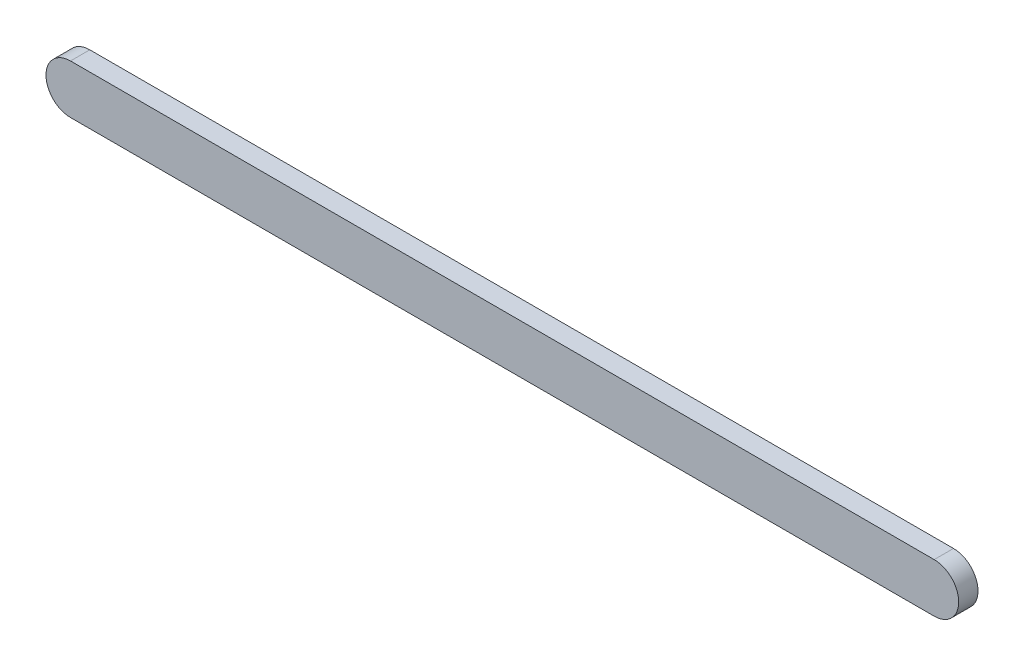
ISO-10303-21;
HEADER;
FILE_DESCRIPTION(('STEP AP214'),'2;1');
FILE_NAME('part.step','',(''),(''),'','','');
FILE_SCHEMA(('AUTOMOTIVE_DESIGN { 1 0 10303 214 1 1 1 1 }'));
ENDSEC;
DATA;
#1=APPLICATION_CONTEXT('core data for automotive mechanical design processes');
#2=APPLICATION_PROTOCOL_DEFINITION('international standard','automotive_design',2000,#1);
#3=PRODUCT_CONTEXT('',#1,'mechanical');
#4=PRODUCT('Part','Part','',(#3));
#5=PRODUCT_RELATED_PRODUCT_CATEGORY('part','',(#4));
#6=PRODUCT_DEFINITION_FORMATION('','',#4);
#7=PRODUCT_DEFINITION_CONTEXT('part definition',#1,'design');
#8=PRODUCT_DEFINITION('design','',#6,#7);
#9=PRODUCT_DEFINITION_SHAPE('','',#8);
#10=(LENGTH_UNIT() NAMED_UNIT(*) SI_UNIT(.MILLI.,.METRE.));
#11=(NAMED_UNIT(*) PLANE_ANGLE_UNIT() SI_UNIT($,.RADIAN.));
#12=(NAMED_UNIT(*) SI_UNIT($,.STERADIAN.) SOLID_ANGLE_UNIT());
#13=UNCERTAINTY_MEASURE_WITH_UNIT(LENGTH_MEASURE(1.E-05),#10,'distance_accuracy_value','');
#14=(GEOMETRIC_REPRESENTATION_CONTEXT(3) GLOBAL_UNCERTAINTY_ASSIGNED_CONTEXT((#13)) GLOBAL_UNIT_ASSIGNED_CONTEXT((#10,
#11,#12)) REPRESENTATION_CONTEXT('',''));
#15=CARTESIAN_POINT('',(0.,0.,0.));
#16=DIRECTION('',(0.,0.,1.));
#17=DIRECTION('',(1.,0.,0.));
#18=AXIS2_PLACEMENT_3D('',#15,#16,#17);
#19=CARTESIAN_POINT('',(132.7021984,59.7662,0.));
#20=DIRECTION('',(0.,1.,0.));
#21=DIRECTION('',(1.,0.,0.));
#22=AXIS2_PLACEMENT_3D('',#19,#20,#21);
#23=PLANE('',#22);
#24=DIRECTION('',(1.,0.,0.));
#25=VECTOR('',#24,1.);
#26=CARTESIAN_POINT('',(132.7021984,59.7662,0.1999996));
#27=LINE('',#26,#25);
#28=CARTESIAN_POINT('',(132.7021984,59.7662,0.1999996));
#29=VERTEX_POINT('',#28);
#30=CARTESIAN_POINT('',(141.6519392,59.7662,0.1999996));
#31=VERTEX_POINT('',#30);
#32=EDGE_CURVE('E11',#29,#31,#27,.T.);
#33=ORIENTED_EDGE('',*,*,#32,.F.);
#34=DIRECTION('',(0.,0.,1.));
#35=VECTOR('',#34,1.);
#36=CARTESIAN_POINT('',(132.7021984,59.7662,0.));
#37=LINE('',#36,#35);
#38=CARTESIAN_POINT('',(132.7021984,59.7662,0.));
#39=VERTEX_POINT('',#38);
#40=EDGE_CURVE('E24',#39,#29,#37,.T.);
#41=ORIENTED_EDGE('',*,*,#40,.F.);
#42=DIRECTION('',(1.,0.,0.));
#43=VECTOR('',#42,1.);
#44=CARTESIAN_POINT('',(132.7021984,59.7662,0.));
#45=LINE('',#44,#43);
#46=CARTESIAN_POINT('',(141.6519392,59.7662,0.));
#47=VERTEX_POINT('',#46);
#48=EDGE_CURVE('E75',#39,#47,#45,.T.);
#49=ORIENTED_EDGE('',*,*,#48,.T.);
#50=DIRECTION('',(0.,0.,1.));
#51=VECTOR('',#50,1.);
#52=CARTESIAN_POINT('',(141.6519392,59.7662,0.));
#53=LINE('',#52,#51);
#54=EDGE_CURVE('E37',#47,#31,#53,.T.);
#55=ORIENTED_EDGE('',*,*,#54,.T.);
#56=EDGE_LOOP('',(#33,#41,#49,#55));
#57=FACE_BOUND('',#56,.T.);
#58=ADVANCED_FACE('F17',(#57),#23,.F.);
#59=CARTESIAN_POINT('',(141.6519392,60.0202,0.));
#60=DIRECTION('',(0.,0.,-1.));
#61=DIRECTION('',(-1.11896493820489E-13,-1.,0.));
#62=AXIS2_PLACEMENT_3D('',#59,#60,#61);
#63=CYLINDRICAL_SURFACE('',#62,0.253999999999998);
#64=CARTESIAN_POINT('',(141.6519392,60.0202,0.1999996));
#65=DIRECTION('',(0.,0.,1.));
#66=DIRECTION('',(-1.11896493820489E-13,-1.,0.));
#67=AXIS2_PLACEMENT_3D('',#64,#65,#66);
#68=CIRCLE('',#67,0.253999999999998);
#69=CARTESIAN_POINT('',(141.6519392,60.2742,0.1999996));
#70=VERTEX_POINT('',#69);
#71=EDGE_CURVE('E83',#31,#70,#68,.T.);
#72=ORIENTED_EDGE('',*,*,#71,.F.);
#73=ORIENTED_EDGE('',*,*,#54,.F.);
#74=CARTESIAN_POINT('',(141.6519392,60.0202,0.));
#75=DIRECTION('',(0.,0.,1.));
#76=DIRECTION('',(-1.11896493820489E-13,-1.,0.));
#77=AXIS2_PLACEMENT_3D('',#74,#75,#76);
#78=CIRCLE('',#77,0.253999999999998);
#79=CARTESIAN_POINT('',(141.6519392,60.2742,0.));
#80=VERTEX_POINT('',#79);
#81=EDGE_CURVE('E81',#47,#80,#78,.T.);
#82=ORIENTED_EDGE('',*,*,#81,.T.);
#83=DIRECTION('',(0.,0.,1.));
#84=VECTOR('',#83,1.);
#85=CARTESIAN_POINT('',(141.6519392,60.2742,0.));
#86=LINE('',#85,#84);
#87=EDGE_CURVE('E67',#80,#70,#86,.T.);
#88=ORIENTED_EDGE('',*,*,#87,.T.);
#89=EDGE_LOOP('',(#72,#73,#82,#88));
#90=FACE_BOUND('',#89,.T.);
#91=ADVANCED_FACE('F89',(#90),#63,.T.);
#92=CARTESIAN_POINT('',(141.6519392,60.2742,0.));
#93=DIRECTION('',(0.,-1.,0.));
#94=DIRECTION('',(-1.,0.,0.));
#95=AXIS2_PLACEMENT_3D('',#92,#93,#94);
#96=PLANE('',#95);
#97=DIRECTION('',(-1.,0.,0.));
#98=VECTOR('',#97,1.);
#99=CARTESIAN_POINT('',(141.6519392,60.2742,0.1999996));
#100=LINE('',#99,#98);
#101=CARTESIAN_POINT('',(132.7021984,60.2742,0.1999996));
#102=VERTEX_POINT('',#101);
#103=EDGE_CURVE('E71',#70,#102,#100,.T.);
#104=ORIENTED_EDGE('',*,*,#103,.F.);
#105=ORIENTED_EDGE('',*,*,#87,.F.);
#106=DIRECTION('',(-1.,0.,0.));
#107=VECTOR('',#106,1.);
#108=CARTESIAN_POINT('',(141.6519392,60.2742,0.));
#109=LINE('',#108,#107);
#110=CARTESIAN_POINT('',(132.7021984,60.2742,0.));
#111=VERTEX_POINT('',#110);
#112=EDGE_CURVE('E63',#80,#111,#109,.T.);
#113=ORIENTED_EDGE('',*,*,#112,.T.);
#114=DIRECTION('',(0.,0.,1.));
#115=VECTOR('',#114,1.);
#116=CARTESIAN_POINT('',(132.7021984,60.2742,0.));
#117=LINE('',#116,#115);
#118=EDGE_CURVE('E53',#111,#102,#117,.T.);
#119=ORIENTED_EDGE('',*,*,#118,.T.);
#120=EDGE_LOOP('',(#104,#105,#113,#119));
#121=FACE_BOUND('',#120,.T.);
#122=ADVANCED_FACE('F66',(#121),#96,.F.);
#123=CARTESIAN_POINT('',(132.7021984,60.0202,0.));
#124=DIRECTION('',(0.,0.,-1.));
#125=DIRECTION('',(0.,1.,0.));
#126=AXIS2_PLACEMENT_3D('',#123,#124,#125);
#127=CYLINDRICAL_SURFACE('',#126,0.253999999999998);
#128=CARTESIAN_POINT('',(132.7021984,60.0202,0.1999996));
#129=DIRECTION('',(0.,0.,1.));
#130=DIRECTION('',(0.,1.,0.));
#131=AXIS2_PLACEMENT_3D('',#128,#129,#130);
#132=CIRCLE('',#131,0.253999999999998);
#133=EDGE_CURVE('E59',#102,#29,#132,.T.);
#134=ORIENTED_EDGE('',*,*,#133,.F.);
#135=ORIENTED_EDGE('',*,*,#118,.F.);
#136=CARTESIAN_POINT('',(132.7021984,60.0202,0.));
#137=DIRECTION('',(0.,0.,1.));
#138=DIRECTION('',(0.,1.,0.));
#139=AXIS2_PLACEMENT_3D('',#136,#137,#138);
#140=CIRCLE('',#139,0.253999999999998);
#141=EDGE_CURVE('E57',#111,#39,#140,.T.);
#142=ORIENTED_EDGE('',*,*,#141,.T.);
#143=ORIENTED_EDGE('',*,*,#40,.T.);
#144=EDGE_LOOP('',(#134,#135,#142,#143));
#145=FACE_BOUND('',#144,.T.);
#146=ADVANCED_FACE('F55',(#145),#127,.T.);
#147=CARTESIAN_POINT('',(132.7021984,59.7662,0.));
#148=DIRECTION('',(0.,0.,-1.));
#149=DIRECTION('',(-1.,0.,0.));
#150=AXIS2_PLACEMENT_3D('',#147,#148,#149);
#151=PLANE('',#150);
#152=ORIENTED_EDGE('',*,*,#141,.F.);
#153=ORIENTED_EDGE('',*,*,#112,.F.);
#154=ORIENTED_EDGE('',*,*,#81,.F.);
#155=ORIENTED_EDGE('',*,*,#48,.F.);
#156=EDGE_LOOP('',(#152,#153,#154,#155));
#157=FACE_BOUND('',#156,.T.);
#158=ADVANCED_FACE('F74',(#157),#151,.T.);
#159=CARTESIAN_POINT('',(132.7021984,59.7662,0.1999996));
#160=DIRECTION('',(0.,0.,-1.));
#161=DIRECTION('',(-1.,0.,0.));
#162=AXIS2_PLACEMENT_3D('',#159,#160,#161);
#163=PLANE('',#162);
#164=ORIENTED_EDGE('',*,*,#32,.T.);
#165=ORIENTED_EDGE('',*,*,#71,.T.);
#166=ORIENTED_EDGE('',*,*,#103,.T.);
#167=ORIENTED_EDGE('',*,*,#133,.T.);
#168=EDGE_LOOP('',(#164,#165,#166,#167));
#169=FACE_BOUND('',#168,.T.);
#170=ADVANCED_FACE('F91',(#169),#163,.F.);
#171=CLOSED_SHELL('',(#58,#91,#122,#146,#158,#170));
#172=MANIFOLD_SOLID_BREP('B1',#171);
#173=ADVANCED_BREP_SHAPE_REPRESENTATION('',(#18,#172),#14);
#174=SHAPE_DEFINITION_REPRESENTATION(#9,#173);
ENDSEC;
END-ISO-10303-21;
